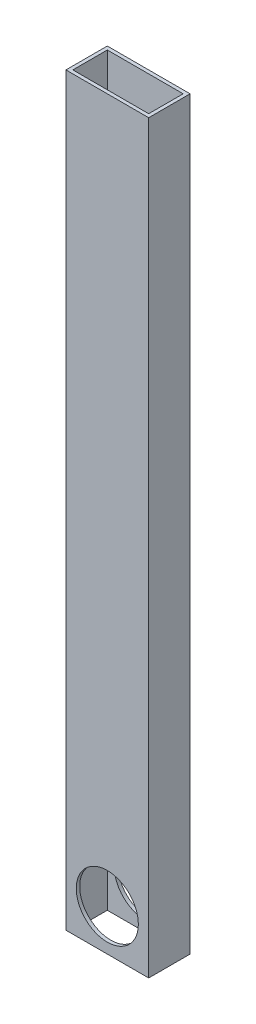
ISO-10303-21;
HEADER;
FILE_DESCRIPTION(('STEP AP214'),'2;1');
FILE_NAME('part.step','',(''),(''),'','','');
FILE_SCHEMA(('AUTOMOTIVE_DESIGN { 1 0 10303 214 1 1 1 1 }'));
ENDSEC;
DATA;
#1=APPLICATION_CONTEXT('core data for automotive mechanical design processes');
#2=APPLICATION_PROTOCOL_DEFINITION('international standard','automotive_design',2000,#1);
#3=PRODUCT_CONTEXT('',#1,'mechanical');
#4=PRODUCT('Part','Part','',(#3));
#5=PRODUCT_RELATED_PRODUCT_CATEGORY('part','',(#4));
#6=PRODUCT_DEFINITION_FORMATION('','',#4);
#7=PRODUCT_DEFINITION_CONTEXT('part definition',#1,'design');
#8=PRODUCT_DEFINITION('design','',#6,#7);
#9=PRODUCT_DEFINITION_SHAPE('','',#8);
#10=(LENGTH_UNIT() NAMED_UNIT(*) SI_UNIT(.MILLI.,.METRE.));
#11=(NAMED_UNIT(*) PLANE_ANGLE_UNIT() SI_UNIT($,.RADIAN.));
#12=(NAMED_UNIT(*) SI_UNIT($,.STERADIAN.) SOLID_ANGLE_UNIT());
#13=UNCERTAINTY_MEASURE_WITH_UNIT(LENGTH_MEASURE(1.E-05),#10,'distance_accuracy_value','');
#14=(GEOMETRIC_REPRESENTATION_CONTEXT(3) GLOBAL_UNCERTAINTY_ASSIGNED_CONTEXT((#13)) GLOBAL_UNIT_ASSIGNED_CONTEXT((#10,
#11,#12)) REPRESENTATION_CONTEXT('',''));
#15=CARTESIAN_POINT('',(0.,0.,0.));
#16=DIRECTION('',(0.,0.,1.));
#17=DIRECTION('',(1.,0.,0.));
#18=AXIS2_PLACEMENT_3D('',#15,#16,#17);
#19=CARTESIAN_POINT('',(0.,342.9,0.));
#20=DIRECTION('',(0.,1.,0.));
#21=DIRECTION('',(0.,0.,1.));
#22=AXIS2_PLACEMENT_3D('',#19,#20,#21);
#23=PLANE('',#22);
#24=DIRECTION('',(0.,0.,1.));
#25=VECTOR('',#24,1.);
#26=CARTESIAN_POINT('',(0.,342.9,0.));
#27=LINE('',#26,#25);
#28=CARTESIAN_POINT('',(0.,342.9,-19.05));
#29=VERTEX_POINT('',#28);
#30=CARTESIAN_POINT('',(0.,342.9,0.));
#31=VERTEX_POINT('',#30);
#32=EDGE_CURVE('E161',#29,#31,#27,.T.);
#33=ORIENTED_EDGE('',*,*,#32,.T.);
#34=DIRECTION('',(1.,0.,0.));
#35=VECTOR('',#34,1.);
#36=CARTESIAN_POINT('',(0.,342.9,0.));
#37=LINE('',#36,#35);
#38=CARTESIAN_POINT('',(38.1,342.9,0.));
#39=VERTEX_POINT('',#38);
#40=EDGE_CURVE('E164',#31,#39,#37,.T.);
#41=ORIENTED_EDGE('',*,*,#40,.T.);
#42=DIRECTION('',(0.,0.,-1.));
#43=VECTOR('',#42,1.);
#44=CARTESIAN_POINT('',(38.1,342.9,0.));
#45=LINE('',#44,#43);
#46=CARTESIAN_POINT('',(38.1,342.9,-19.05));
#47=VERTEX_POINT('',#46);
#48=EDGE_CURVE('E167',#39,#47,#45,.T.);
#49=ORIENTED_EDGE('',*,*,#48,.T.);
#50=DIRECTION('',(-1.,0.,0.));
#51=VECTOR('',#50,1.);
#52=CARTESIAN_POINT('',(0.,342.9,-19.05));
#53=LINE('',#52,#51);
#54=EDGE_CURVE('E169',#47,#29,#53,.T.);
#55=ORIENTED_EDGE('',*,*,#54,.T.);
#56=EDGE_LOOP('',(#33,#41,#49,#55));
#57=FACE_BOUND('',#56,.T.);
#58=DIRECTION('',(1.,0.,0.));
#59=VECTOR('',#58,1.);
#60=CARTESIAN_POINT('',(0.,342.9,-1.5875));
#61=LINE('',#60,#59);
#62=CARTESIAN_POINT('',(1.5875,342.9,-1.5875));
#63=VERTEX_POINT('',#62);
#64=CARTESIAN_POINT('',(36.5125,342.9,-1.5875));
#65=VERTEX_POINT('',#64);
#66=EDGE_CURVE('E131',#63,#65,#61,.T.);
#67=ORIENTED_EDGE('',*,*,#66,.F.);
#68=DIRECTION('',(0.,0.,1.));
#69=VECTOR('',#68,1.);
#70=CARTESIAN_POINT('',(1.5875,342.9,0.));
#71=LINE('',#70,#69);
#72=CARTESIAN_POINT('',(1.5875,342.9,-17.4625));
#73=VERTEX_POINT('',#72);
#74=EDGE_CURVE('E123',#73,#63,#71,.T.);
#75=ORIENTED_EDGE('',*,*,#74,.F.);
#76=DIRECTION('',(-1.,0.,0.));
#77=VECTOR('',#76,1.);
#78=CARTESIAN_POINT('',(0.,342.9,-17.4625));
#79=LINE('',#78,#77);
#80=CARTESIAN_POINT('',(36.5125,342.9,-17.4625));
#81=VERTEX_POINT('',#80);
#82=EDGE_CURVE('E145',#81,#73,#79,.T.);
#83=ORIENTED_EDGE('',*,*,#82,.F.);
#84=DIRECTION('',(0.,0.,-1.));
#85=VECTOR('',#84,1.);
#86=CARTESIAN_POINT('',(36.5125,342.9,0.));
#87=LINE('',#86,#85);
#88=EDGE_CURVE('E143',#65,#81,#87,.T.);
#89=ORIENTED_EDGE('',*,*,#88,.F.);
#90=EDGE_LOOP('',(#67,#75,#83,#89));
#91=FACE_BOUND('',#90,.T.);
#92=ADVANCED_FACE('F57',(#57,#91),#23,.T.);
#93=CARTESIAN_POINT('',(0.,0.,0.));
#94=DIRECTION('',(0.,1.,0.));
#95=DIRECTION('',(0.,0.,1.));
#96=AXIS2_PLACEMENT_3D('',#93,#94,#95);
#97=PLANE('',#96);
#98=DIRECTION('',(0.,0.,1.));
#99=VECTOR('',#98,1.);
#100=CARTESIAN_POINT('',(0.,0.,0.));
#101=LINE('',#100,#99);
#102=CARTESIAN_POINT('',(0.,0.,-19.05));
#103=VERTEX_POINT('',#102);
#104=CARTESIAN_POINT('',(0.,0.,0.));
#105=VERTEX_POINT('',#104);
#106=EDGE_CURVE('E139',#103,#105,#101,.T.);
#107=ORIENTED_EDGE('',*,*,#106,.F.);
#108=DIRECTION('',(-1.,0.,0.));
#109=VECTOR('',#108,1.);
#110=CARTESIAN_POINT('',(0.,0.,-19.05));
#111=LINE('',#110,#109);
#112=CARTESIAN_POINT('',(38.1,0.,-19.05));
#113=VERTEX_POINT('',#112);
#114=EDGE_CURVE('E165',#113,#103,#111,.T.);
#115=ORIENTED_EDGE('',*,*,#114,.F.);
#116=DIRECTION('',(0.,0.,-1.));
#117=VECTOR('',#116,1.);
#118=CARTESIAN_POINT('',(38.1,0.,0.));
#119=LINE('',#118,#117);
#120=CARTESIAN_POINT('',(38.1,0.,0.));
#121=VERTEX_POINT('',#120);
#122=EDGE_CURVE('E176',#121,#113,#119,.T.);
#123=ORIENTED_EDGE('',*,*,#122,.F.);
#124=DIRECTION('',(1.,0.,0.));
#125=VECTOR('',#124,1.);
#126=CARTESIAN_POINT('',(0.,0.,0.));
#127=LINE('',#126,#125);
#128=EDGE_CURVE('E174',#105,#121,#127,.T.);
#129=ORIENTED_EDGE('',*,*,#128,.F.);
#130=EDGE_LOOP('',(#107,#115,#123,#129));
#131=FACE_BOUND('',#130,.T.);
#132=DIRECTION('',(0.,0.,1.));
#133=VECTOR('',#132,1.);
#134=CARTESIAN_POINT('',(1.5875,0.,0.));
#135=LINE('',#134,#133);
#136=CARTESIAN_POINT('',(1.5875,0.,-17.4625));
#137=VERTEX_POINT('',#136);
#138=CARTESIAN_POINT('',(1.5875,0.,-1.5875));
#139=VERTEX_POINT('',#138);
#140=EDGE_CURVE('E81',#137,#139,#135,.T.);
#141=ORIENTED_EDGE('',*,*,#140,.T.);
#142=DIRECTION('',(1.,0.,0.));
#143=VECTOR('',#142,1.);
#144=CARTESIAN_POINT('',(0.,0.,-1.5875));
#145=LINE('',#144,#143);
#146=CARTESIAN_POINT('',(36.5125,0.,-1.5875));
#147=VERTEX_POINT('',#146);
#148=EDGE_CURVE('E138',#139,#147,#145,.T.);
#149=ORIENTED_EDGE('',*,*,#148,.T.);
#150=DIRECTION('',(0.,0.,-1.));
#151=VECTOR('',#150,1.);
#152=CARTESIAN_POINT('',(36.5125,0.,0.));
#153=LINE('',#152,#151);
#154=CARTESIAN_POINT('',(36.5125,0.,-17.4625));
#155=VERTEX_POINT('',#154);
#156=EDGE_CURVE('E153',#147,#155,#153,.T.);
#157=ORIENTED_EDGE('',*,*,#156,.T.);
#158=DIRECTION('',(-1.,0.,0.));
#159=VECTOR('',#158,1.);
#160=CARTESIAN_POINT('',(0.,0.,-17.4625));
#161=LINE('',#160,#159);
#162=EDGE_CURVE('E132',#155,#137,#161,.T.);
#163=ORIENTED_EDGE('',*,*,#162,.T.);
#164=EDGE_LOOP('',(#141,#149,#157,#163));
#165=FACE_BOUND('',#164,.T.);
#166=ADVANCED_FACE('F195',(#131,#165),#97,.F.);
#167=CARTESIAN_POINT('',(0.,342.9,0.));
#168=DIRECTION('',(1.,0.,0.));
#169=DIRECTION('',(0.,0.,-1.));
#170=AXIS2_PLACEMENT_3D('',#167,#168,#169);
#171=PLANE('',#170);
#172=ORIENTED_EDGE('',*,*,#106,.T.);
#173=DIRECTION('',(0.,-1.,0.));
#174=VECTOR('',#173,1.);
#175=CARTESIAN_POINT('',(0.,342.9,0.));
#176=LINE('',#175,#174);
#177=EDGE_CURVE('E12',#31,#105,#176,.T.);
#178=ORIENTED_EDGE('',*,*,#177,.F.);
#179=ORIENTED_EDGE('',*,*,#32,.F.);
#180=DIRECTION('',(0.,-1.,0.));
#181=VECTOR('',#180,1.);
#182=CARTESIAN_POINT('',(0.,342.9,-19.05));
#183=LINE('',#182,#181);
#184=EDGE_CURVE('E171',#29,#103,#183,.T.);
#185=ORIENTED_EDGE('',*,*,#184,.T.);
#186=EDGE_LOOP('',(#172,#178,#179,#185));
#187=FACE_BOUND('',#186,.T.);
#188=ADVANCED_FACE('F59',(#187),#171,.F.);
#189=CARTESIAN_POINT('',(0.,342.9,0.));
#190=DIRECTION('',(0.,0.,-1.));
#191=DIRECTION('',(-1.,0.,0.));
#192=AXIS2_PLACEMENT_3D('',#189,#190,#191);
#193=PLANE('',#192);
#194=CARTESIAN_POINT('',(19.05,19.05,0.));
#195=DIRECTION('',(0.,0.,1.));
#196=DIRECTION('',(1.,0.,0.));
#197=AXIS2_PLACEMENT_3D('',#194,#195,#196);
#198=CIRCLE('',#197,14.2875);
#199=CARTESIAN_POINT('',(33.3375,19.05,0.));
#200=VERTEX_POINT('',#199);
#201=EDGE_CURVE('E232',#200,#200,#198,.T.);
#202=ORIENTED_EDGE('',*,*,#201,.F.);
#203=EDGE_LOOP('',(#202));
#204=FACE_BOUND('',#203,.T.);
#205=ORIENTED_EDGE('',*,*,#128,.T.);
#206=DIRECTION('',(0.,-1.,0.));
#207=VECTOR('',#206,1.);
#208=CARTESIAN_POINT('',(38.1,342.9,0.));
#209=LINE('',#208,#207);
#210=EDGE_CURVE('E66',#39,#121,#209,.T.);
#211=ORIENTED_EDGE('',*,*,#210,.F.);
#212=ORIENTED_EDGE('',*,*,#40,.F.);
#213=ORIENTED_EDGE('',*,*,#177,.T.);
#214=EDGE_LOOP('',(#205,#211,#212,#213));
#215=FACE_BOUND('',#214,.T.);
#216=ADVANCED_FACE('F205',(#204,#215),#193,.F.);
#217=CARTESIAN_POINT('',(38.1,342.9,0.));
#218=DIRECTION('',(-1.,0.,0.));
#219=DIRECTION('',(0.,0.,1.));
#220=AXIS2_PLACEMENT_3D('',#217,#218,#219);
#221=PLANE('',#220);
#222=ORIENTED_EDGE('',*,*,#122,.T.);
#223=DIRECTION('',(0.,-1.,0.));
#224=VECTOR('',#223,1.);
#225=CARTESIAN_POINT('',(38.1,342.9,-19.05));
#226=LINE('',#225,#224);
#227=EDGE_CURVE('E181',#47,#113,#226,.T.);
#228=ORIENTED_EDGE('',*,*,#227,.F.);
#229=ORIENTED_EDGE('',*,*,#48,.F.);
#230=ORIENTED_EDGE('',*,*,#210,.T.);
#231=EDGE_LOOP('',(#222,#228,#229,#230));
#232=FACE_BOUND('',#231,.T.);
#233=ADVANCED_FACE('F189',(#232),#221,.F.);
#234=CARTESIAN_POINT('',(0.,342.9,-19.05));
#235=DIRECTION('',(0.,0.,1.));
#236=DIRECTION('',(1.,0.,0.));
#237=AXIS2_PLACEMENT_3D('',#234,#235,#236);
#238=PLANE('',#237);
#239=CARTESIAN_POINT('',(19.05,19.05,-19.05));
#240=DIRECTION('',(0.,0.,1.));
#241=DIRECTION('',(1.,0.,0.));
#242=AXIS2_PLACEMENT_3D('',#239,#240,#241);
#243=CIRCLE('',#242,14.2875);
#244=CARTESIAN_POINT('',(33.3375,19.05,-19.05));
#245=VERTEX_POINT('',#244);
#246=EDGE_CURVE('E230',#245,#245,#243,.T.);
#247=ORIENTED_EDGE('',*,*,#246,.T.);
#248=EDGE_LOOP('',(#247));
#249=FACE_BOUND('',#248,.T.);
#250=ORIENTED_EDGE('',*,*,#114,.T.);
#251=ORIENTED_EDGE('',*,*,#184,.F.);
#252=ORIENTED_EDGE('',*,*,#54,.F.);
#253=ORIENTED_EDGE('',*,*,#227,.T.);
#254=EDGE_LOOP('',(#250,#251,#252,#253));
#255=FACE_BOUND('',#254,.T.);
#256=ADVANCED_FACE('F199',(#249,#255),#238,.F.);
#257=CARTESIAN_POINT('',(1.5875,342.9,0.));
#258=DIRECTION('',(1.,0.,0.));
#259=DIRECTION('',(0.,0.,-1.));
#260=AXIS2_PLACEMENT_3D('',#257,#258,#259);
#261=PLANE('',#260);
#262=ORIENTED_EDGE('',*,*,#140,.F.);
#263=DIRECTION('',(0.,-1.,0.));
#264=VECTOR('',#263,1.);
#265=CARTESIAN_POINT('',(1.5875,342.9,-17.4625));
#266=LINE('',#265,#264);
#267=EDGE_CURVE('E127',#73,#137,#266,.T.);
#268=ORIENTED_EDGE('',*,*,#267,.F.);
#269=ORIENTED_EDGE('',*,*,#74,.T.);
#270=DIRECTION('',(0.,-1.,0.));
#271=VECTOR('',#270,1.);
#272=CARTESIAN_POINT('',(1.5875,342.9,-1.5875));
#273=LINE('',#272,#271);
#274=EDGE_CURVE('E126',#63,#139,#273,.T.);
#275=ORIENTED_EDGE('',*,*,#274,.T.);
#276=EDGE_LOOP('',(#262,#268,#269,#275));
#277=FACE_BOUND('',#276,.T.);
#278=ADVANCED_FACE('F125',(#277),#261,.T.);
#279=CARTESIAN_POINT('',(0.,342.9,-1.5875));
#280=DIRECTION('',(0.,0.,-1.));
#281=DIRECTION('',(-1.,0.,0.));
#282=AXIS2_PLACEMENT_3D('',#279,#280,#281);
#283=PLANE('',#282);
#284=CARTESIAN_POINT('',(19.05,19.05,-1.5875));
#285=DIRECTION('',(0.,0.,-1.));
#286=DIRECTION('',(-1.,0.,0.));
#287=AXIS2_PLACEMENT_3D('',#284,#285,#286);
#288=CIRCLE('',#287,14.2875);
#289=CARTESIAN_POINT('',(33.3375,19.05,-1.5875));
#290=VERTEX_POINT('',#289);
#291=EDGE_CURVE('E151',#290,#290,#288,.T.);
#292=ORIENTED_EDGE('',*,*,#291,.F.);
#293=EDGE_LOOP('',(#292));
#294=FACE_BOUND('',#293,.T.);
#295=ORIENTED_EDGE('',*,*,#148,.F.);
#296=ORIENTED_EDGE('',*,*,#274,.F.);
#297=ORIENTED_EDGE('',*,*,#66,.T.);
#298=DIRECTION('',(0.,-1.,0.));
#299=VECTOR('',#298,1.);
#300=CARTESIAN_POINT('',(36.5125,342.9,-1.5875));
#301=LINE('',#300,#299);
#302=EDGE_CURVE('E140',#65,#147,#301,.T.);
#303=ORIENTED_EDGE('',*,*,#302,.T.);
#304=EDGE_LOOP('',(#295,#296,#297,#303));
#305=FACE_BOUND('',#304,.T.);
#306=ADVANCED_FACE('F135',(#294,#305),#283,.T.);
#307=CARTESIAN_POINT('',(36.5125,342.9,0.));
#308=DIRECTION('',(-1.,0.,0.));
#309=DIRECTION('',(0.,0.,1.));
#310=AXIS2_PLACEMENT_3D('',#307,#308,#309);
#311=PLANE('',#310);
#312=ORIENTED_EDGE('',*,*,#156,.F.);
#313=ORIENTED_EDGE('',*,*,#302,.F.);
#314=ORIENTED_EDGE('',*,*,#88,.T.);
#315=DIRECTION('',(0.,-1.,0.));
#316=VECTOR('',#315,1.);
#317=CARTESIAN_POINT('',(36.5125,342.9,-17.4625));
#318=LINE('',#317,#316);
#319=EDGE_CURVE('E73',#81,#155,#318,.T.);
#320=ORIENTED_EDGE('',*,*,#319,.T.);
#321=EDGE_LOOP('',(#312,#313,#314,#320));
#322=FACE_BOUND('',#321,.T.);
#323=ADVANCED_FACE('F244',(#322),#311,.T.);
#324=CARTESIAN_POINT('',(0.,342.9,-17.4625));
#325=DIRECTION('',(0.,0.,1.));
#326=DIRECTION('',(1.,0.,0.));
#327=AXIS2_PLACEMENT_3D('',#324,#325,#326);
#328=PLANE('',#327);
#329=CARTESIAN_POINT('',(19.05,19.05,-17.4625));
#330=DIRECTION('',(0.,0.,1.));
#331=DIRECTION('',(1.,0.,0.));
#332=AXIS2_PLACEMENT_3D('',#329,#330,#331);
#333=CIRCLE('',#332,14.2875);
#334=CARTESIAN_POINT('',(33.3375,19.05,-17.4625));
#335=VERTEX_POINT('',#334);
#336=EDGE_CURVE('E61',#335,#335,#333,.T.);
#337=ORIENTED_EDGE('',*,*,#336,.F.);
#338=EDGE_LOOP('',(#337));
#339=FACE_BOUND('',#338,.T.);
#340=ORIENTED_EDGE('',*,*,#162,.F.);
#341=ORIENTED_EDGE('',*,*,#319,.F.);
#342=ORIENTED_EDGE('',*,*,#82,.T.);
#343=ORIENTED_EDGE('',*,*,#267,.T.);
#344=EDGE_LOOP('',(#340,#341,#342,#343));
#345=FACE_BOUND('',#344,.T.);
#346=ADVANCED_FACE('F248',(#339,#345),#328,.T.);
#347=CARTESIAN_POINT('',(19.05,19.05,-19.05));
#348=DIRECTION('',(0.,0.,1.));
#349=DIRECTION('',(1.,0.,0.));
#350=AXIS2_PLACEMENT_3D('',#347,#348,#349);
#351=CYLINDRICAL_SURFACE('',#350,14.2875);
#352=CARTESIAN_POINT('',(33.3375,19.05,-17.4625));
#353=CARTESIAN_POINT('',(33.3375,19.05,-17.4790364583333));
#354=CARTESIAN_POINT('',(33.3375,19.05,-17.4955729166667));
#355=CARTESIAN_POINT('',(33.3375,19.05,-17.5286458333333));
#356=CARTESIAN_POINT('',(33.3375,19.05,-17.5451822916667));
#357=CARTESIAN_POINT('',(33.3375,19.05,-17.5782552083333));
#358=CARTESIAN_POINT('',(33.3375,19.05,-17.5947916666667));
#359=CARTESIAN_POINT('',(33.3375,19.05,-17.6278645833333));
#360=CARTESIAN_POINT('',(33.3375,19.05,-17.6444010416667));
#361=CARTESIAN_POINT('',(33.3375,19.05,-17.6774739583333));
#362=CARTESIAN_POINT('',(33.3375,19.05,-17.6940104166667));
#363=CARTESIAN_POINT('',(33.3375,19.05,-17.7270833333333));
#364=CARTESIAN_POINT('',(33.3375,19.05,-17.7436197916667));
#365=CARTESIAN_POINT('',(33.3375,19.05,-17.7766927083333));
#366=CARTESIAN_POINT('',(33.3375,19.05,-17.7932291666667));
#367=CARTESIAN_POINT('',(33.3375,19.05,-17.8263020833333));
#368=CARTESIAN_POINT('',(33.3375,19.05,-17.8428385416667));
#369=CARTESIAN_POINT('',(33.3375,19.05,-17.8759114583333));
#370=CARTESIAN_POINT('',(33.3375,19.05,-17.8924479166667));
#371=CARTESIAN_POINT('',(33.3375,19.05,-17.9255208333333));
#372=CARTESIAN_POINT('',(33.3375,19.05,-17.9420572916667));
#373=CARTESIAN_POINT('',(33.3375,19.05,-17.9751302083333));
#374=CARTESIAN_POINT('',(33.3375,19.05,-17.9916666666667));
#375=CARTESIAN_POINT('',(33.3375,19.05,-18.0247395833333));
#376=CARTESIAN_POINT('',(33.3375,19.05,-18.0412760416667));
#377=CARTESIAN_POINT('',(33.3375,19.05,-18.0743489583333));
#378=CARTESIAN_POINT('',(33.3375,19.05,-18.0908854166667));
#379=CARTESIAN_POINT('',(33.3375,19.05,-18.1239583333333));
#380=CARTESIAN_POINT('',(33.3375,19.05,-18.1404947916667));
#381=CARTESIAN_POINT('',(33.3375,19.05,-18.1735677083333));
#382=CARTESIAN_POINT('',(33.3375,19.05,-18.1901041666667));
#383=CARTESIAN_POINT('',(33.3375,19.05,-18.2231770833333));
#384=CARTESIAN_POINT('',(33.3375,19.05,-18.2397135416667));
#385=CARTESIAN_POINT('',(33.3375,19.05,-18.2727864583333));
#386=CARTESIAN_POINT('',(33.3375,19.05,-18.2893229166667));
#387=CARTESIAN_POINT('',(33.3375,19.05,-18.3223958333333));
#388=CARTESIAN_POINT('',(33.3375,19.05,-18.3389322916667));
#389=CARTESIAN_POINT('',(33.3375,19.05,-18.3720052083333));
#390=CARTESIAN_POINT('',(33.3375,19.05,-18.3885416666667));
#391=CARTESIAN_POINT('',(33.3375,19.05,-18.4216145833333));
#392=CARTESIAN_POINT('',(33.3375,19.05,-18.4381510416667));
#393=CARTESIAN_POINT('',(33.3375,19.05,-18.4712239583333));
#394=CARTESIAN_POINT('',(33.3375,19.05,-18.4877604166667));
#395=CARTESIAN_POINT('',(33.3375,19.05,-18.5208333333333));
#396=CARTESIAN_POINT('',(33.3375,19.05,-18.5373697916667));
#397=CARTESIAN_POINT('',(33.3375,19.05,-18.5704427083333));
#398=CARTESIAN_POINT('',(33.3375,19.05,-18.5869791666667));
#399=CARTESIAN_POINT('',(33.3375,19.05,-18.6200520833333));
#400=CARTESIAN_POINT('',(33.3375,19.05,-18.6365885416667));
#401=CARTESIAN_POINT('',(33.3375,19.05,-18.6696614583333));
#402=CARTESIAN_POINT('',(33.3375,19.05,-18.6861979166667));
#403=CARTESIAN_POINT('',(33.3375,19.05,-18.7192708333333));
#404=CARTESIAN_POINT('',(33.3375,19.05,-18.7358072916667));
#405=CARTESIAN_POINT('',(33.3375,19.05,-18.7688802083333));
#406=CARTESIAN_POINT('',(33.3375,19.05,-18.7854166666667));
#407=CARTESIAN_POINT('',(33.3375,19.05,-18.8184895833333));
#408=CARTESIAN_POINT('',(33.3375,19.05,-18.8350260416667));
#409=CARTESIAN_POINT('',(33.3375,19.05,-18.8680989583333));
#410=CARTESIAN_POINT('',(33.3375,19.05,-18.8846354166667));
#411=CARTESIAN_POINT('',(33.3375,19.05,-18.9177083333333));
#412=CARTESIAN_POINT('',(33.3375,19.05,-18.9342447916667));
#413=CARTESIAN_POINT('',(33.3375,19.05,-18.9673177083333));
#414=CARTESIAN_POINT('',(33.3375,19.05,-18.9838541666667));
#415=CARTESIAN_POINT('',(33.3375,19.05,-19.0169270833333));
#416=CARTESIAN_POINT('',(33.3375,19.05,-19.0334635416667));
#417=CARTESIAN_POINT('',(33.3375,19.05,-19.05));
#418=B_SPLINE_CURVE_WITH_KNOTS('',3,(#352,#353,#354,#355,#356,#357,#358,#359,#360,#361,#362,
#363,#364,#365,#366,#367,#368,#369,#370,#371,#372,#373,#374,#375,#376,#377,#378,#379,#380,#381,
#382,#383,#384,#385,#386,#387,#388,#389,#390,#391,#392,#393,#394,#395,#396,#397,#398,#399,#400,
#401,#402,#403,#404,#405,#406,#407,#408,#409,#410,#411,#412,#413,#414,#415,#416,#417),
.UNSPECIFIED.,.F.,.F.,(4,2,2,2,2,2,2,2,2,2,2,2,2,2,2,2,2,2,2,2,2,2,2,2,2,2,2,2,2,2,2,2,4),(0.,
0.0496093750000023,0.0992187500000012,0.148828125,0.198437500000002,0.248046875000001,
0.29765625,0.347265625000003,0.396875000000001,0.446484375,0.496093750000003,0.545703125000002,
0.5953125,0.644921875000003,0.694531250000002,0.744140625,0.793749999999999,0.843359375000002,
0.892968750000001,0.942578124999999,0.992187500000002,1.041796875,1.09140625,1.141015625,
1.190625,1.240234375,1.28984375,1.339453125,1.3890625,1.438671875,1.48828125,1.537890625,
1.5875),.UNSPECIFIED.);
#419=EDGE_CURVE('BSEAM254',#335,#245,#418,.T.);
#420=ORIENTED_EDGE('',*,*,#336,.T.);
#421=ORIENTED_EDGE('',*,*,#246,.F.);
#422=ORIENTED_EDGE('',*,*,#419,.T.);
#423=ORIENTED_EDGE('',*,*,#419,.F.);
#424=EDGE_LOOP('',(#420,#422,#421,#423));
#425=FACE_BOUND('',#424,.T.);
#426=ADVANCED_FACE('F254',(#425),#351,.F.);
#427=CARTESIAN_POINT('',(33.3375,19.05,-1.5875));
#428=CARTESIAN_POINT('',(33.3375,19.05,-1.57096354166667));
#429=CARTESIAN_POINT('',(33.3375,19.05,-1.55442708333333));
#430=CARTESIAN_POINT('',(33.3375,19.05,-1.52135416666667));
#431=CARTESIAN_POINT('',(33.3375,19.05,-1.50481770833333));
#432=CARTESIAN_POINT('',(33.3375,19.05,-1.47174479166666));
#433=CARTESIAN_POINT('',(33.3375,19.05,-1.45520833333333));
#434=CARTESIAN_POINT('',(33.3375,19.05,-1.42213541666667));
#435=CARTESIAN_POINT('',(33.3375,19.05,-1.40559895833333));
#436=CARTESIAN_POINT('',(33.3375,19.05,-1.37252604166667));
#437=CARTESIAN_POINT('',(33.3375,19.05,-1.35598958333333));
#438=CARTESIAN_POINT('',(33.3375,19.05,-1.32291666666666));
#439=CARTESIAN_POINT('',(33.3375,19.05,-1.30638020833333));
#440=CARTESIAN_POINT('',(33.3375,19.05,-1.27330729166667));
#441=CARTESIAN_POINT('',(33.3375,19.05,-1.25677083333333));
#442=CARTESIAN_POINT('',(33.3375,19.05,-1.22369791666667));
#443=CARTESIAN_POINT('',(33.3375,19.05,-1.20716145833333));
#444=CARTESIAN_POINT('',(33.3375,19.05,-1.17408854166667));
#445=CARTESIAN_POINT('',(33.3375,19.05,-1.15755208333333));
#446=CARTESIAN_POINT('',(33.3375,19.05,-1.12447916666667));
#447=CARTESIAN_POINT('',(33.3375,19.05,-1.10794270833333));
#448=CARTESIAN_POINT('',(33.3375,19.05,-1.07486979166667));
#449=CARTESIAN_POINT('',(33.3375,19.05,-1.05833333333333));
#450=CARTESIAN_POINT('',(33.3375,19.05,-1.02526041666667));
#451=CARTESIAN_POINT('',(33.3375,19.05,-1.00872395833333));
#452=CARTESIAN_POINT('',(33.3375,19.05,-0.975651041666665));
#453=CARTESIAN_POINT('',(33.3375,19.05,-0.959114583333332));
#454=CARTESIAN_POINT('',(33.3375,19.05,-0.926041666666666));
#455=CARTESIAN_POINT('',(33.3375,19.05,-0.909505208333333));
#456=CARTESIAN_POINT('',(33.3375,19.05,-0.876432291666666));
#457=CARTESIAN_POINT('',(33.3375,19.05,-0.859895833333332));
#458=CARTESIAN_POINT('',(33.3375,19.05,-0.826822916666665));
#459=CARTESIAN_POINT('',(33.3375,19.05,-0.810286458333332));
#460=CARTESIAN_POINT('',(33.3375,19.05,-0.777213541666666));
#461=CARTESIAN_POINT('',(33.3375,19.05,-0.760677083333333));
#462=CARTESIAN_POINT('',(33.3375,19.05,-0.727604166666666));
#463=CARTESIAN_POINT('',(33.3375,19.05,-0.711067708333332));
#464=CARTESIAN_POINT('',(33.3375,19.05,-0.677994791666665));
#465=CARTESIAN_POINT('',(33.3375,19.05,-0.661458333333332));
#466=CARTESIAN_POINT('',(33.3375,19.05,-0.628385416666666));
#467=CARTESIAN_POINT('',(33.3375,19.05,-0.611848958333333));
#468=CARTESIAN_POINT('',(33.3375,19.05,-0.578776041666666));
#469=CARTESIAN_POINT('',(33.3375,19.05,-0.562239583333332));
#470=CARTESIAN_POINT('',(33.3375,19.05,-0.529166666666665));
#471=CARTESIAN_POINT('',(33.3375,19.05,-0.512630208333332));
#472=CARTESIAN_POINT('',(33.3375,19.05,-0.479557291666666));
#473=CARTESIAN_POINT('',(33.3375,19.05,-0.463020833333333));
#474=CARTESIAN_POINT('',(33.3375,19.05,-0.429947916666666));
#475=CARTESIAN_POINT('',(33.3375,19.05,-0.413411458333332));
#476=CARTESIAN_POINT('',(33.3375,19.05,-0.380338541666665));
#477=CARTESIAN_POINT('',(33.3375,19.05,-0.363802083333332));
#478=CARTESIAN_POINT('',(33.3375,19.05,-0.330729166666666));
#479=CARTESIAN_POINT('',(33.3375,19.05,-0.314192708333333));
#480=CARTESIAN_POINT('',(33.3375,19.05,-0.281119791666667));
#481=CARTESIAN_POINT('',(33.3375,19.05,-0.264583333333334));
#482=CARTESIAN_POINT('',(33.3375,19.05,-0.231510416666667));
#483=CARTESIAN_POINT('',(33.3375,19.05,-0.214973958333333));
#484=CARTESIAN_POINT('',(33.3375,19.05,-0.181901041666666));
#485=CARTESIAN_POINT('',(33.3375,19.05,-0.165364583333333));
#486=CARTESIAN_POINT('',(33.3375,19.05,-0.132291666666667));
#487=CARTESIAN_POINT('',(33.3375,19.05,-0.115755208333334));
#488=CARTESIAN_POINT('',(33.3375,19.05,-0.0826822916666671));
#489=CARTESIAN_POINT('',(33.3375,19.05,-0.066145833333333));
#490=CARTESIAN_POINT('',(33.3375,19.05,-0.0330729166666659));
#491=CARTESIAN_POINT('',(33.3375,19.05,-0.016536458333333));
#492=CARTESIAN_POINT('',(33.3375,19.05,0.));
#493=B_SPLINE_CURVE_WITH_KNOTS('',3,(#427,#428,#429,#430,#431,#432,#433,#434,#435,#436,#437,
#438,#439,#440,#441,#442,#443,#444,#445,#446,#447,#448,#449,#450,#451,#452,#453,#454,#455,#456,
#457,#458,#459,#460,#461,#462,#463,#464,#465,#466,#467,#468,#469,#470,#471,#472,#473,#474,#475,
#476,#477,#478,#479,#480,#481,#482,#483,#484,#485,#486,#487,#488,#489,#490,#491,#492),
.UNSPECIFIED.,.F.,.F.,(4,2,2,2,2,2,2,2,2,2,2,2,2,2,2,2,2,2,2,2,2,2,2,2,2,2,2,2,2,2,2,2,4),(0.,
0.0496093749999989,0.0992187500000012,0.148828125,0.198437499999999,0.248046875000001,
0.29765625,0.347265624999999,0.396874999999998,0.446484375,0.496093749999999,0.545703124999998,
0.5953125,0.644921874999999,0.694531249999998,0.744140625,0.793749999999999,0.843359374999998,
0.892968750000001,0.942578124999999,0.992187499999998,1.041796875,1.09140625,1.141015625,
1.190625,1.240234375,1.28984375,1.339453125,1.3890625,1.438671875,1.48828125,1.537890625,
1.5875),.UNSPECIFIED.);
#494=EDGE_CURVE('BSEAM240',#290,#200,#493,.T.);
#495=ORIENTED_EDGE('',*,*,#291,.T.);
#496=ORIENTED_EDGE('',*,*,#201,.T.);
#497=ORIENTED_EDGE('',*,*,#494,.T.);
#498=ORIENTED_EDGE('',*,*,#494,.F.);
#499=EDGE_LOOP('',(#495,#497,#496,#498));
#500=FACE_BOUND('',#499,.T.);
#501=ADVANCED_FACE('F240',(#500),#351,.F.);
#502=CLOSED_SHELL('',(#92,#166,#188,#216,#233,#256,#278,#306,#323,#346,#426,#501));
#503=MANIFOLD_SOLID_BREP('B2',#502);
#504=ADVANCED_BREP_SHAPE_REPRESENTATION('',(#18,#503),#14);
#505=SHAPE_DEFINITION_REPRESENTATION(#9,#504);
ENDSEC;
END-ISO-10303-21;
